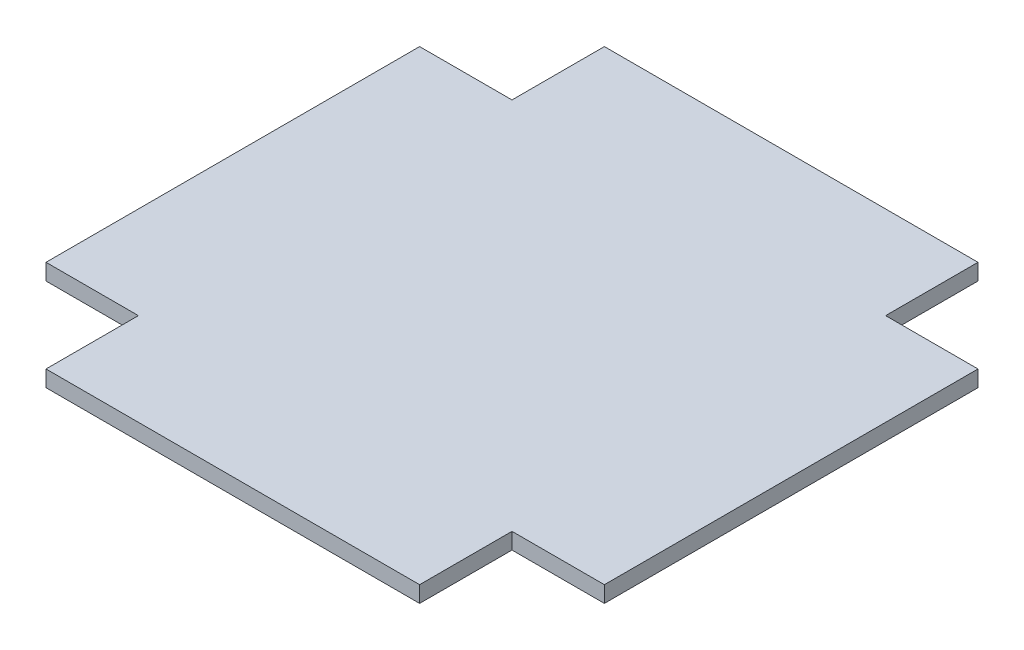
ISO-10303-21;
HEADER;
FILE_DESCRIPTION(('STEP AP214'),'2;1');
FILE_NAME('part.step','',(''),(''),'','','');
FILE_SCHEMA(('AUTOMOTIVE_DESIGN { 1 0 10303 214 1 1 1 1 }'));
ENDSEC;
DATA;
#1=APPLICATION_CONTEXT('core data for automotive mechanical design processes');
#2=APPLICATION_PROTOCOL_DEFINITION('international standard','automotive_design',2000,#1);
#3=PRODUCT_CONTEXT('',#1,'mechanical');
#4=PRODUCT('Part','Part','',(#3));
#5=PRODUCT_RELATED_PRODUCT_CATEGORY('part','',(#4));
#6=PRODUCT_DEFINITION_FORMATION('','',#4);
#7=PRODUCT_DEFINITION_CONTEXT('part definition',#1,'design');
#8=PRODUCT_DEFINITION('design','',#6,#7);
#9=PRODUCT_DEFINITION_SHAPE('','',#8);
#10=(LENGTH_UNIT() NAMED_UNIT(*) SI_UNIT(.MILLI.,.METRE.));
#11=(NAMED_UNIT(*) PLANE_ANGLE_UNIT() SI_UNIT($,.RADIAN.));
#12=(NAMED_UNIT(*) SI_UNIT($,.STERADIAN.) SOLID_ANGLE_UNIT());
#13=UNCERTAINTY_MEASURE_WITH_UNIT(LENGTH_MEASURE(1.E-05),#10,'distance_accuracy_value','');
#14=(GEOMETRIC_REPRESENTATION_CONTEXT(3) GLOBAL_UNCERTAINTY_ASSIGNED_CONTEXT((#13)) GLOBAL_UNIT_ASSIGNED_CONTEXT((#10,
#11,#12)) REPRESENTATION_CONTEXT('',''));
#15=CARTESIAN_POINT('',(0.,0.,0.));
#16=DIRECTION('',(0.,0.,1.));
#17=DIRECTION('',(1.,0.,0.));
#18=AXIS2_PLACEMENT_3D('',#15,#16,#17);
#19=CARTESIAN_POINT('',(-0.0659999999998891,4.064,199.136));
#20=DIRECTION('',(-1.,0.,0.));
#21=DIRECTION('',(0.,0.,1.));
#22=AXIS2_PLACEMENT_3D('',#19,#20,#21);
#23=PLANE('',#22);
#24=DIRECTION('',(0.,0.,-1.));
#25=VECTOR('',#24,1.);
#26=CARTESIAN_POINT('',(-0.0659999999998891,0.,199.136));
#27=LINE('',#26,#25);
#28=CARTESIAN_POINT('',(-0.0659999999999064,0.,222.25));
#29=VERTEX_POINT('',#28);
#30=CARTESIAN_POINT('',(-0.0659999999998891,0.,199.136));
#31=VERTEX_POINT('',#30);
#32=EDGE_CURVE('E154',#29,#31,#27,.T.);
#33=ORIENTED_EDGE('',*,*,#32,.T.);
#34=DIRECTION('',(0.,-1.,0.));
#35=VECTOR('',#34,1.);
#36=CARTESIAN_POINT('',(-0.0659999999998891,4.064,199.136));
#37=LINE('',#36,#35);
#38=CARTESIAN_POINT('',(-0.0659999999998891,4.064,199.136));
#39=VERTEX_POINT('',#38);
#40=EDGE_CURVE('E11',#39,#31,#37,.T.);
#41=ORIENTED_EDGE('',*,*,#40,.F.);
#42=DIRECTION('',(0.,0.,-1.));
#43=VECTOR('',#42,1.);
#44=CARTESIAN_POINT('',(-0.0659999999998891,4.064,199.136));
#45=LINE('',#44,#43);
#46=CARTESIAN_POINT('',(-0.0659999999999064,4.064,222.25));
#47=VERTEX_POINT('',#46);
#48=EDGE_CURVE('E176',#47,#39,#45,.T.);
#49=ORIENTED_EDGE('',*,*,#48,.F.);
#50=DIRECTION('',(0.,-1.,0.));
#51=VECTOR('',#50,1.);
#52=CARTESIAN_POINT('',(-0.0659999999999064,4.064,222.25));
#53=LINE('',#52,#51);
#54=EDGE_CURVE('E150',#47,#29,#53,.T.);
#55=ORIENTED_EDGE('',*,*,#54,.T.);
#56=EDGE_LOOP('',(#33,#41,#49,#55));
#57=FACE_BOUND('',#56,.T.);
#58=ADVANCED_FACE('F34',(#57),#23,.F.);
#59=CARTESIAN_POINT('',(23.0480000000002,4.064,199.136));
#60=DIRECTION('',(0.,0.,-1.));
#61=DIRECTION('',(-1.,0.,0.));
#62=AXIS2_PLACEMENT_3D('',#59,#60,#61);
#63=PLANE('',#62);
#64=DIRECTION('',(1.,0.,0.));
#65=VECTOR('',#64,1.);
#66=CARTESIAN_POINT('',(23.0480000000002,0.,199.136));
#67=LINE('',#66,#65);
#68=CARTESIAN_POINT('',(23.0480000000002,0.,199.136));
#69=VERTEX_POINT('',#68);
#70=EDGE_CURVE('E157',#31,#69,#67,.T.);
#71=ORIENTED_EDGE('',*,*,#70,.T.);
#72=DIRECTION('',(0.,-1.,0.));
#73=VECTOR('',#72,1.);
#74=CARTESIAN_POINT('',(23.0480000000002,4.064,199.136));
#75=LINE('',#74,#73);
#76=CARTESIAN_POINT('',(23.0480000000002,4.064,199.136));
#77=VERTEX_POINT('',#76);
#78=EDGE_CURVE('E42',#77,#69,#75,.T.);
#79=ORIENTED_EDGE('',*,*,#78,.F.);
#80=DIRECTION('',(1.,0.,0.));
#81=VECTOR('',#80,1.);
#82=CARTESIAN_POINT('',(23.0480000000002,4.064,199.136));
#83=LINE('',#82,#81);
#84=EDGE_CURVE('E105',#39,#77,#83,.T.);
#85=ORIENTED_EDGE('',*,*,#84,.F.);
#86=ORIENTED_EDGE('',*,*,#40,.T.);
#87=EDGE_LOOP('',(#71,#79,#85,#86));
#88=FACE_BOUND('',#87,.T.);
#89=ADVANCED_FACE('F254',(#88),#63,.F.);
#90=CARTESIAN_POINT('',(23.0480000000001,4.064,105.664));
#91=DIRECTION('',(-1.,0.,0.));
#92=DIRECTION('',(0.,0.,1.));
#93=AXIS2_PLACEMENT_3D('',#90,#91,#92);
#94=PLANE('',#93);
#95=DIRECTION('',(0.,0.,-1.));
#96=VECTOR('',#95,1.);
#97=CARTESIAN_POINT('',(23.0480000000001,0.,105.664));
#98=LINE('',#97,#96);
#99=CARTESIAN_POINT('',(23.0480000000001,0.,105.664));
#100=VERTEX_POINT('',#99);
#101=EDGE_CURVE('E159',#69,#100,#98,.T.);
#102=ORIENTED_EDGE('',*,*,#101,.T.);
#103=DIRECTION('',(0.,-1.,0.));
#104=VECTOR('',#103,1.);
#105=CARTESIAN_POINT('',(23.0480000000001,4.064,105.664));
#106=LINE('',#105,#104);
#107=CARTESIAN_POINT('',(23.0480000000001,4.064,105.664));
#108=VERTEX_POINT('',#107);
#109=EDGE_CURVE('E195',#108,#100,#106,.T.);
#110=ORIENTED_EDGE('',*,*,#109,.F.);
#111=DIRECTION('',(0.,0.,-1.));
#112=VECTOR('',#111,1.);
#113=CARTESIAN_POINT('',(23.0480000000001,4.064,105.664));
#114=LINE('',#113,#112);
#115=EDGE_CURVE('E203',#77,#108,#114,.T.);
#116=ORIENTED_EDGE('',*,*,#115,.F.);
#117=ORIENTED_EDGE('',*,*,#78,.T.);
#118=EDGE_LOOP('',(#102,#110,#116,#117));
#119=FACE_BOUND('',#118,.T.);
#120=ADVANCED_FACE('F201',(#119),#94,.F.);
#121=CARTESIAN_POINT('',(-0.0659999999999064,4.064,105.664));
#122=DIRECTION('',(0.,0.,1.));
#123=DIRECTION('',(1.,0.,0.));
#124=AXIS2_PLACEMENT_3D('',#121,#122,#123);
#125=PLANE('',#124);
#126=DIRECTION('',(-1.,0.,0.));
#127=VECTOR('',#126,1.);
#128=CARTESIAN_POINT('',(-0.0659999999999064,0.,105.664));
#129=LINE('',#128,#127);
#130=CARTESIAN_POINT('',(-0.0659999999999064,0.,105.664));
#131=VERTEX_POINT('',#130);
#132=EDGE_CURVE('E161',#100,#131,#129,.T.);
#133=ORIENTED_EDGE('',*,*,#132,.T.);
#134=DIRECTION('',(0.,-1.,0.));
#135=VECTOR('',#134,1.);
#136=CARTESIAN_POINT('',(-0.0659999999999064,4.064,105.664));
#137=LINE('',#136,#135);
#138=CARTESIAN_POINT('',(-0.0659999999999064,4.064,105.664));
#139=VERTEX_POINT('',#138);
#140=EDGE_CURVE('E192',#139,#131,#137,.T.);
#141=ORIENTED_EDGE('',*,*,#140,.F.);
#142=DIRECTION('',(-1.,0.,0.));
#143=VECTOR('',#142,1.);
#144=CARTESIAN_POINT('',(-0.0659999999999064,4.064,105.664));
#145=LINE('',#144,#143);
#146=EDGE_CURVE('E221',#108,#139,#145,.T.);
#147=ORIENTED_EDGE('',*,*,#146,.F.);
#148=ORIENTED_EDGE('',*,*,#109,.T.);
#149=EDGE_LOOP('',(#133,#141,#147,#148));
#150=FACE_BOUND('',#149,.T.);
#151=ADVANCED_FACE('F212',(#150),#125,.F.);
#152=CARTESIAN_POINT('',(-0.065999999999896,4.064,82.55));
#153=DIRECTION('',(-1.,0.,0.));
#154=DIRECTION('',(0.,0.,1.));
#155=AXIS2_PLACEMENT_3D('',#152,#153,#154);
#156=PLANE('',#155);
#157=DIRECTION('',(0.,0.,-1.));
#158=VECTOR('',#157,1.);
#159=CARTESIAN_POINT('',(-0.065999999999896,0.,82.55));
#160=LINE('',#159,#158);
#161=CARTESIAN_POINT('',(-0.065999999999896,0.,82.55));
#162=VERTEX_POINT('',#161);
#163=EDGE_CURVE('E163',#131,#162,#160,.T.);
#164=ORIENTED_EDGE('',*,*,#163,.T.);
#165=DIRECTION('',(0.,-1.,0.));
#166=VECTOR('',#165,1.);
#167=CARTESIAN_POINT('',(-0.065999999999896,4.064,82.55));
#168=LINE('',#167,#166);
#169=CARTESIAN_POINT('',(-0.065999999999896,4.064,82.55));
#170=VERTEX_POINT('',#169);
#171=EDGE_CURVE('E189',#170,#162,#168,.T.);
#172=ORIENTED_EDGE('',*,*,#171,.F.);
#173=DIRECTION('',(0.,0.,-1.));
#174=VECTOR('',#173,1.);
#175=CARTESIAN_POINT('',(-0.065999999999896,4.064,82.55));
#176=LINE('',#175,#174);
#177=EDGE_CURVE('E218',#139,#170,#176,.T.);
#178=ORIENTED_EDGE('',*,*,#177,.F.);
#179=ORIENTED_EDGE('',*,*,#140,.T.);
#180=EDGE_LOOP('',(#164,#172,#178,#179));
#181=FACE_BOUND('',#180,.T.);
#182=ADVANCED_FACE('F216',(#181),#156,.F.);
#183=CARTESIAN_POINT('',(-93.5379999999999,4.064,82.55));
#184=DIRECTION('',(0.,0.,1.));
#185=DIRECTION('',(1.,0.,0.));
#186=AXIS2_PLACEMENT_3D('',#183,#184,#185);
#187=PLANE('',#186);
#188=DIRECTION('',(-1.,0.,0.));
#189=VECTOR('',#188,1.);
#190=CARTESIAN_POINT('',(-93.5379999999999,0.,82.55));
#191=LINE('',#190,#189);
#192=CARTESIAN_POINT('',(-93.5379999999999,0.,82.55));
#193=VERTEX_POINT('',#192);
#194=EDGE_CURVE('E165',#162,#193,#191,.T.);
#195=ORIENTED_EDGE('',*,*,#194,.T.);
#196=DIRECTION('',(0.,-1.,0.));
#197=VECTOR('',#196,1.);
#198=CARTESIAN_POINT('',(-93.5379999999999,4.064,82.55));
#199=LINE('',#198,#197);
#200=CARTESIAN_POINT('',(-93.5379999999999,4.064,82.55));
#201=VERTEX_POINT('',#200);
#202=EDGE_CURVE('E186',#201,#193,#199,.T.);
#203=ORIENTED_EDGE('',*,*,#202,.F.);
#204=DIRECTION('',(-1.,0.,0.));
#205=VECTOR('',#204,1.);
#206=CARTESIAN_POINT('',(-93.5379999999999,4.064,82.55));
#207=LINE('',#206,#205);
#208=EDGE_CURVE('E220',#170,#201,#207,.T.);
#209=ORIENTED_EDGE('',*,*,#208,.F.);
#210=ORIENTED_EDGE('',*,*,#171,.T.);
#211=EDGE_LOOP('',(#195,#203,#209,#210));
#212=FACE_BOUND('',#211,.T.);
#213=ADVANCED_FACE('F267',(#212),#187,.F.);
#214=CARTESIAN_POINT('',(-93.5379999999999,4.064,105.664));
#215=DIRECTION('',(1.,0.,0.));
#216=DIRECTION('',(0.,0.,-1.));
#217=AXIS2_PLACEMENT_3D('',#214,#215,#216);
#218=PLANE('',#217);
#219=DIRECTION('',(0.,0.,1.));
#220=VECTOR('',#219,1.);
#221=CARTESIAN_POINT('',(-93.5379999999999,0.,105.664));
#222=LINE('',#221,#220);
#223=CARTESIAN_POINT('',(-93.5379999999999,0.,105.664));
#224=VERTEX_POINT('',#223);
#225=EDGE_CURVE('E167',#193,#224,#222,.T.);
#226=ORIENTED_EDGE('',*,*,#225,.T.);
#227=DIRECTION('',(0.,-1.,0.));
#228=VECTOR('',#227,1.);
#229=CARTESIAN_POINT('',(-93.5379999999999,4.064,105.664));
#230=LINE('',#229,#228);
#231=CARTESIAN_POINT('',(-93.5379999999999,4.064,105.664));
#232=VERTEX_POINT('',#231);
#233=EDGE_CURVE('E183',#232,#224,#230,.T.);
#234=ORIENTED_EDGE('',*,*,#233,.F.);
#235=DIRECTION('',(0.,0.,1.));
#236=VECTOR('',#235,1.);
#237=CARTESIAN_POINT('',(-93.5379999999999,4.064,105.664));
#238=LINE('',#237,#236);
#239=EDGE_CURVE('E223',#201,#232,#238,.T.);
#240=ORIENTED_EDGE('',*,*,#239,.F.);
#241=ORIENTED_EDGE('',*,*,#202,.T.);
#242=EDGE_LOOP('',(#226,#234,#240,#241));
#243=FACE_BOUND('',#242,.T.);
#244=ADVANCED_FACE('F270',(#243),#218,.F.);
#245=CARTESIAN_POINT('',(-93.5379999999999,4.064,105.664));
#246=DIRECTION('',(0.,0.,1.));
#247=DIRECTION('',(1.,0.,0.));
#248=AXIS2_PLACEMENT_3D('',#245,#246,#247);
#249=PLANE('',#248);
#250=DIRECTION('',(-1.,0.,0.));
#251=VECTOR('',#250,1.);
#252=CARTESIAN_POINT('',(-93.5379999999999,0.,105.664));
#253=LINE('',#252,#251);
#254=CARTESIAN_POINT('',(-116.652,0.,105.664));
#255=VERTEX_POINT('',#254);
#256=EDGE_CURVE('E169',#224,#255,#253,.T.);
#257=ORIENTED_EDGE('',*,*,#256,.T.);
#258=DIRECTION('',(0.,-1.,0.));
#259=VECTOR('',#258,1.);
#260=CARTESIAN_POINT('',(-116.652,4.064,105.664));
#261=LINE('',#260,#259);
#262=CARTESIAN_POINT('',(-116.652,4.064,105.664));
#263=VERTEX_POINT('',#262);
#264=EDGE_CURVE('E180',#263,#255,#261,.T.);
#265=ORIENTED_EDGE('',*,*,#264,.F.);
#266=DIRECTION('',(-1.,0.,0.));
#267=VECTOR('',#266,1.);
#268=CARTESIAN_POINT('',(-93.5379999999999,4.064,105.664));
#269=LINE('',#268,#267);
#270=EDGE_CURVE('E229',#232,#263,#269,.T.);
#271=ORIENTED_EDGE('',*,*,#270,.F.);
#272=ORIENTED_EDGE('',*,*,#233,.T.);
#273=EDGE_LOOP('',(#257,#265,#271,#272));
#274=FACE_BOUND('',#273,.T.);
#275=ADVANCED_FACE('F235',(#274),#249,.F.);
#276=CARTESIAN_POINT('',(-116.652,4.064,105.664));
#277=DIRECTION('',(1.,0.,0.));
#278=DIRECTION('',(0.,0.,-1.));
#279=AXIS2_PLACEMENT_3D('',#276,#277,#278);
#280=PLANE('',#279);
#281=DIRECTION('',(0.,0.,1.));
#282=VECTOR('',#281,1.);
#283=CARTESIAN_POINT('',(-116.652,0.,105.664));
#284=LINE('',#283,#282);
#285=CARTESIAN_POINT('',(-116.652,0.,199.136));
#286=VERTEX_POINT('',#285);
#287=EDGE_CURVE('E171',#255,#286,#284,.T.);
#288=ORIENTED_EDGE('',*,*,#287,.T.);
#289=DIRECTION('',(0.,-1.,0.));
#290=VECTOR('',#289,1.);
#291=CARTESIAN_POINT('',(-116.652,4.064,199.136));
#292=LINE('',#291,#290);
#293=CARTESIAN_POINT('',(-116.652,4.064,199.136));
#294=VERTEX_POINT('',#293);
#295=EDGE_CURVE('E145',#294,#286,#292,.T.);
#296=ORIENTED_EDGE('',*,*,#295,.F.);
#297=DIRECTION('',(0.,0.,1.));
#298=VECTOR('',#297,1.);
#299=CARTESIAN_POINT('',(-116.652,4.064,105.664));
#300=LINE('',#299,#298);
#301=EDGE_CURVE('E136',#263,#294,#300,.T.);
#302=ORIENTED_EDGE('',*,*,#301,.F.);
#303=ORIENTED_EDGE('',*,*,#264,.T.);
#304=EDGE_LOOP('',(#288,#296,#302,#303));
#305=FACE_BOUND('',#304,.T.);
#306=ADVANCED_FACE('F239',(#305),#280,.F.);
#307=CARTESIAN_POINT('',(-116.652,4.064,199.136));
#308=DIRECTION('',(0.,0.,-1.));
#309=DIRECTION('',(-1.,0.,0.));
#310=AXIS2_PLACEMENT_3D('',#307,#308,#309);
#311=PLANE('',#310);
#312=DIRECTION('',(1.,0.,0.));
#313=VECTOR('',#312,1.);
#314=CARTESIAN_POINT('',(-116.652,0.,199.136));
#315=LINE('',#314,#313);
#316=CARTESIAN_POINT('',(-93.5379999999999,0.,199.136));
#317=VERTEX_POINT('',#316);
#318=EDGE_CURVE('E144',#286,#317,#315,.T.);
#319=ORIENTED_EDGE('',*,*,#318,.T.);
#320=DIRECTION('',(0.,-1.,0.));
#321=VECTOR('',#320,1.);
#322=CARTESIAN_POINT('',(-93.5379999999999,4.064,199.136));
#323=LINE('',#322,#321);
#324=CARTESIAN_POINT('',(-93.5379999999999,4.064,199.136));
#325=VERTEX_POINT('',#324);
#326=EDGE_CURVE('E141',#325,#317,#323,.T.);
#327=ORIENTED_EDGE('',*,*,#326,.F.);
#328=DIRECTION('',(1.,0.,0.));
#329=VECTOR('',#328,1.);
#330=CARTESIAN_POINT('',(-116.652,4.064,199.136));
#331=LINE('',#330,#329);
#332=EDGE_CURVE('E130',#294,#325,#331,.T.);
#333=ORIENTED_EDGE('',*,*,#332,.F.);
#334=ORIENTED_EDGE('',*,*,#295,.T.);
#335=EDGE_LOOP('',(#319,#327,#333,#334));
#336=FACE_BOUND('',#335,.T.);
#337=ADVANCED_FACE('F142',(#336),#311,.F.);
#338=CARTESIAN_POINT('',(-93.5379999999999,4.064,222.25));
#339=DIRECTION('',(1.,0.,0.));
#340=DIRECTION('',(0.,0.,-1.));
#341=AXIS2_PLACEMENT_3D('',#338,#339,#340);
#342=PLANE('',#341);
#343=DIRECTION('',(0.,0.,1.));
#344=VECTOR('',#343,1.);
#345=CARTESIAN_POINT('',(-93.5379999999999,0.,222.25));
#346=LINE('',#345,#344);
#347=CARTESIAN_POINT('',(-93.5379999999999,0.,222.25));
#348=VERTEX_POINT('',#347);
#349=EDGE_CURVE('E91',#317,#348,#346,.T.);
#350=ORIENTED_EDGE('',*,*,#349,.T.);
#351=DIRECTION('',(0.,-1.,0.));
#352=VECTOR('',#351,1.);
#353=CARTESIAN_POINT('',(-93.5379999999999,4.064,222.25));
#354=LINE('',#353,#352);
#355=CARTESIAN_POINT('',(-93.5379999999999,4.064,222.25));
#356=VERTEX_POINT('',#355);
#357=EDGE_CURVE('E146',#356,#348,#354,.T.);
#358=ORIENTED_EDGE('',*,*,#357,.F.);
#359=DIRECTION('',(0.,0.,1.));
#360=VECTOR('',#359,1.);
#361=CARTESIAN_POINT('',(-93.5379999999999,4.064,222.25));
#362=LINE('',#361,#360);
#363=EDGE_CURVE('E134',#325,#356,#362,.T.);
#364=ORIENTED_EDGE('',*,*,#363,.F.);
#365=ORIENTED_EDGE('',*,*,#326,.T.);
#366=EDGE_LOOP('',(#350,#358,#364,#365));
#367=FACE_BOUND('',#366,.T.);
#368=ADVANCED_FACE('F148',(#367),#342,.F.);
#369=CARTESIAN_POINT('',(-0.0659999999999064,4.064,222.25));
#370=DIRECTION('',(0.,0.,-1.));
#371=DIRECTION('',(-1.,0.,0.));
#372=AXIS2_PLACEMENT_3D('',#369,#370,#371);
#373=PLANE('',#372);
#374=DIRECTION('',(1.,0.,0.));
#375=VECTOR('',#374,1.);
#376=CARTESIAN_POINT('',(-0.0659999999999064,0.,222.25));
#377=LINE('',#376,#375);
#378=EDGE_CURVE('E97',#348,#29,#377,.T.);
#379=ORIENTED_EDGE('',*,*,#378,.T.);
#380=ORIENTED_EDGE('',*,*,#54,.F.);
#381=DIRECTION('',(1.,0.,0.));
#382=VECTOR('',#381,1.);
#383=CARTESIAN_POINT('',(-0.0659999999999064,4.064,222.25));
#384=LINE('',#383,#382);
#385=EDGE_CURVE('E50',#356,#47,#384,.T.);
#386=ORIENTED_EDGE('',*,*,#385,.F.);
#387=ORIENTED_EDGE('',*,*,#357,.T.);
#388=EDGE_LOOP('',(#379,#380,#386,#387));
#389=FACE_BOUND('',#388,.T.);
#390=ADVANCED_FACE('F243',(#389),#373,.F.);
#391=CARTESIAN_POINT('',(0.,4.064,0.));
#392=DIRECTION('',(0.,-1.,0.));
#393=DIRECTION('',(0.,0.,-1.));
#394=AXIS2_PLACEMENT_3D('',#391,#392,#393);
#395=PLANE('',#394);
#396=ORIENTED_EDGE('',*,*,#48,.T.);
#397=ORIENTED_EDGE('',*,*,#84,.T.);
#398=ORIENTED_EDGE('',*,*,#115,.T.);
#399=ORIENTED_EDGE('',*,*,#146,.T.);
#400=ORIENTED_EDGE('',*,*,#177,.T.);
#401=ORIENTED_EDGE('',*,*,#208,.T.);
#402=ORIENTED_EDGE('',*,*,#239,.T.);
#403=ORIENTED_EDGE('',*,*,#270,.T.);
#404=ORIENTED_EDGE('',*,*,#301,.T.);
#405=ORIENTED_EDGE('',*,*,#332,.T.);
#406=ORIENTED_EDGE('',*,*,#363,.T.);
#407=ORIENTED_EDGE('',*,*,#385,.T.);
#408=EDGE_LOOP('',(#396,#397,#398,#399,#400,#401,#402,#403,#404,#405,#406,#407));
#409=FACE_BOUND('',#408,.T.);
#410=ADVANCED_FACE('F132',(#409),#395,.F.);
#411=CARTESIAN_POINT('',(0.,0.,0.));
#412=DIRECTION('',(0.,-1.,0.));
#413=DIRECTION('',(0.,0.,-1.));
#414=AXIS2_PLACEMENT_3D('',#411,#412,#413);
#415=PLANE('',#414);
#416=ORIENTED_EDGE('',*,*,#32,.F.);
#417=ORIENTED_EDGE('',*,*,#378,.F.);
#418=ORIENTED_EDGE('',*,*,#349,.F.);
#419=ORIENTED_EDGE('',*,*,#318,.F.);
#420=ORIENTED_EDGE('',*,*,#287,.F.);
#421=ORIENTED_EDGE('',*,*,#256,.F.);
#422=ORIENTED_EDGE('',*,*,#225,.F.);
#423=ORIENTED_EDGE('',*,*,#194,.F.);
#424=ORIENTED_EDGE('',*,*,#163,.F.);
#425=ORIENTED_EDGE('',*,*,#132,.F.);
#426=ORIENTED_EDGE('',*,*,#101,.F.);
#427=ORIENTED_EDGE('',*,*,#70,.F.);
#428=EDGE_LOOP('',(#416,#417,#418,#419,#420,#421,#422,#423,#424,#425,#426,#427));
#429=FACE_BOUND('',#428,.T.);
#430=ADVANCED_FACE('F207',(#429),#415,.T.);
#431=CLOSED_SHELL('',(#58,#89,#120,#151,#182,#213,#244,#275,#306,#337,#368,#390,#410,#430));
#432=MANIFOLD_SOLID_BREP('B2',#431);
#433=ADVANCED_BREP_SHAPE_REPRESENTATION('',(#18,#432),#14);
#434=SHAPE_DEFINITION_REPRESENTATION(#9,#433);
ENDSEC;
END-ISO-10303-21;
